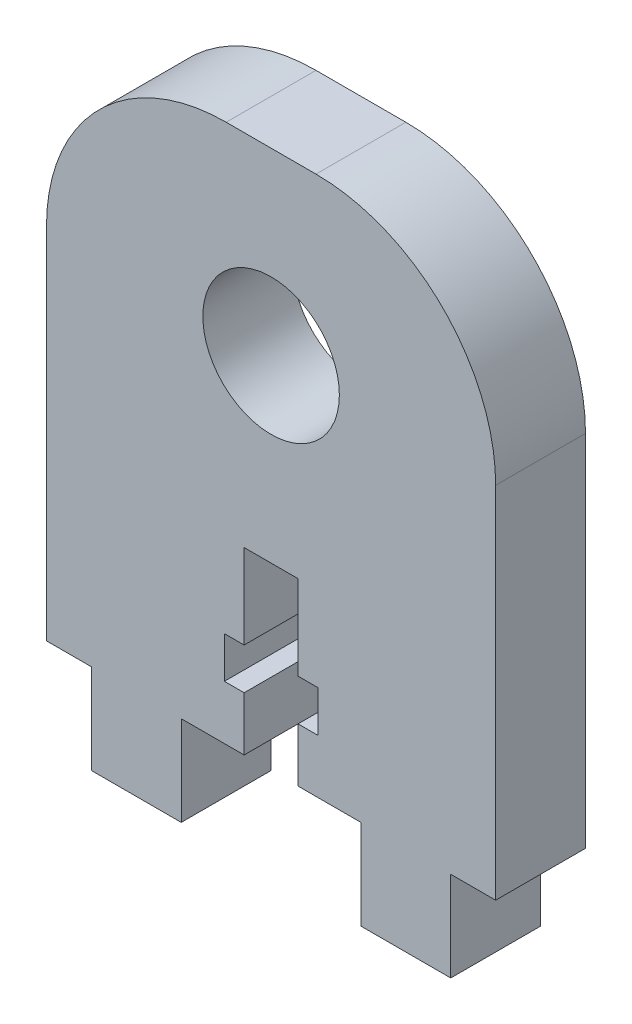
ISO-10303-21;
HEADER;
FILE_DESCRIPTION(('STEP AP214'),'2;1');
FILE_NAME('part.step','',(''),(''),'','','');
FILE_SCHEMA(('AUTOMOTIVE_DESIGN { 1 0 10303 214 1 1 1 1 }'));
ENDSEC;
DATA;
#1=APPLICATION_CONTEXT('core data for automotive mechanical design processes');
#2=APPLICATION_PROTOCOL_DEFINITION('international standard','automotive_design',2000,#1);
#3=PRODUCT_CONTEXT('',#1,'mechanical');
#4=PRODUCT('Part','Part','',(#3));
#5=PRODUCT_RELATED_PRODUCT_CATEGORY('part','',(#4));
#6=PRODUCT_DEFINITION_FORMATION('','',#4);
#7=PRODUCT_DEFINITION_CONTEXT('part definition',#1,'design');
#8=PRODUCT_DEFINITION('design','',#6,#7);
#9=PRODUCT_DEFINITION_SHAPE('','',#8);
#10=(LENGTH_UNIT() NAMED_UNIT(*) SI_UNIT(.MILLI.,.METRE.));
#11=(NAMED_UNIT(*) PLANE_ANGLE_UNIT() SI_UNIT($,.RADIAN.));
#12=(NAMED_UNIT(*) SI_UNIT($,.STERADIAN.) SOLID_ANGLE_UNIT());
#13=UNCERTAINTY_MEASURE_WITH_UNIT(LENGTH_MEASURE(1.E-05),#10,'distance_accuracy_value','');
#14=(GEOMETRIC_REPRESENTATION_CONTEXT(3) GLOBAL_UNCERTAINTY_ASSIGNED_CONTEXT((#13)) GLOBAL_UNIT_ASSIGNED_CONTEXT((#10,
#11,#12)) REPRESENTATION_CONTEXT('',''));
#15=CARTESIAN_POINT('',(0.,0.,0.));
#16=DIRECTION('',(0.,0.,1.));
#17=DIRECTION('',(1.,0.,0.));
#18=AXIS2_PLACEMENT_3D('',#15,#16,#17);
#19=CARTESIAN_POINT('',(-1.5,0.,5.));
#20=DIRECTION('',(1.,0.,0.));
#21=DIRECTION('',(0.,1.,0.));
#22=AXIS2_PLACEMENT_3D('',#19,#20,#21);
#23=PLANE('',#22);
#24=DIRECTION('',(0.,-1.,0.));
#25=VECTOR('',#24,1.);
#26=CARTESIAN_POINT('',(-1.5,0.,0.));
#27=LINE('',#26,#25);
#28=CARTESIAN_POINT('',(-1.5,-12.,0.));
#29=VERTEX_POINT('',#28);
#30=CARTESIAN_POINT('',(-1.5,-15.,0.));
#31=VERTEX_POINT('',#30);
#32=EDGE_CURVE('E219',#29,#31,#27,.T.);
#33=ORIENTED_EDGE('',*,*,#32,.F.);
#34=DIRECTION('',(0.,0.,-1.));
#35=VECTOR('',#34,1.);
#36=CARTESIAN_POINT('',(-1.5,-12.,5.));
#37=LINE('',#36,#35);
#38=CARTESIAN_POINT('',(-1.5,-12.,5.));
#39=VERTEX_POINT('',#38);
#40=EDGE_CURVE('E214',#39,#29,#37,.T.);
#41=ORIENTED_EDGE('',*,*,#40,.F.);
#42=DIRECTION('',(0.,-1.,0.));
#43=VECTOR('',#42,1.);
#44=CARTESIAN_POINT('',(-1.5,0.,5.));
#45=LINE('',#44,#43);
#46=CARTESIAN_POINT('',(-1.5,-15.,5.));
#47=VERTEX_POINT('',#46);
#48=EDGE_CURVE('E217',#39,#47,#45,.T.);
#49=ORIENTED_EDGE('',*,*,#48,.T.);
#50=DIRECTION('',(0.,0.,-1.));
#51=VECTOR('',#50,1.);
#52=CARTESIAN_POINT('',(-1.5,-15.,5.));
#53=LINE('',#52,#51);
#54=EDGE_CURVE('E399',#47,#31,#53,.T.);
#55=ORIENTED_EDGE('',*,*,#54,.T.);
#56=EDGE_LOOP('',(#33,#41,#49,#55));
#57=FACE_BOUND('',#56,.T.);
#58=ADVANCED_FACE('F40',(#57),#23,.T.);
#59=CARTESIAN_POINT('',(0.,-12.,5.));
#60=DIRECTION('',(0.,-1.,0.));
#61=DIRECTION('',(1.,0.,0.));
#62=AXIS2_PLACEMENT_3D('',#59,#60,#61);
#63=PLANE('',#62);
#64=DIRECTION('',(-1.,0.,0.));
#65=VECTOR('',#64,1.);
#66=CARTESIAN_POINT('',(0.,-12.,0.));
#67=LINE('',#66,#65);
#68=CARTESIAN_POINT('',(-2.6,-12.,0.));
#69=VERTEX_POINT('',#68);
#70=EDGE_CURVE('E452',#29,#69,#67,.T.);
#71=ORIENTED_EDGE('',*,*,#70,.T.);
#72=DIRECTION('',(0.,0.,-1.));
#73=VECTOR('',#72,1.);
#74=CARTESIAN_POINT('',(-2.6,-12.,5.));
#75=LINE('',#74,#73);
#76=CARTESIAN_POINT('',(-2.6,-12.,5.));
#77=VERTEX_POINT('',#76);
#78=EDGE_CURVE('E223',#77,#69,#75,.T.);
#79=ORIENTED_EDGE('',*,*,#78,.F.);
#80=DIRECTION('',(-1.,0.,0.));
#81=VECTOR('',#80,1.);
#82=CARTESIAN_POINT('',(0.,-12.,5.));
#83=LINE('',#82,#81);
#84=EDGE_CURVE('E226',#39,#77,#83,.T.);
#85=ORIENTED_EDGE('',*,*,#84,.F.);
#86=ORIENTED_EDGE('',*,*,#40,.T.);
#87=EDGE_LOOP('',(#71,#79,#85,#86));
#88=FACE_BOUND('',#87,.T.);
#89=ADVANCED_FACE('F227',(#88),#63,.F.);
#90=CARTESIAN_POINT('',(-2.60000000000001,0.,5.));
#91=DIRECTION('',(-1.,0.,0.));
#92=DIRECTION('',(0.,-1.,0.));
#93=AXIS2_PLACEMENT_3D('',#90,#91,#92);
#94=PLANE('',#93);
#95=DIRECTION('',(0.,1.,0.));
#96=VECTOR('',#95,1.);
#97=CARTESIAN_POINT('',(-2.60000000000001,0.,0.));
#98=LINE('',#97,#96);
#99=CARTESIAN_POINT('',(-2.6,-9.7,0.));
#100=VERTEX_POINT('',#99);
#101=EDGE_CURVE('E450',#69,#100,#98,.T.);
#102=ORIENTED_EDGE('',*,*,#101,.T.);
#103=DIRECTION('',(0.,0.,-1.));
#104=VECTOR('',#103,1.);
#105=CARTESIAN_POINT('',(-2.6,-9.7,5.));
#106=LINE('',#105,#104);
#107=CARTESIAN_POINT('',(-2.6,-9.7,5.));
#108=VERTEX_POINT('',#107);
#109=EDGE_CURVE('E352',#108,#100,#106,.T.);
#110=ORIENTED_EDGE('',*,*,#109,.F.);
#111=DIRECTION('',(0.,1.,0.));
#112=VECTOR('',#111,1.);
#113=CARTESIAN_POINT('',(-2.60000000000001,0.,5.));
#114=LINE('',#113,#112);
#115=EDGE_CURVE('E231',#77,#108,#114,.T.);
#116=ORIENTED_EDGE('',*,*,#115,.F.);
#117=ORIENTED_EDGE('',*,*,#78,.T.);
#118=EDGE_LOOP('',(#102,#110,#116,#117));
#119=FACE_BOUND('',#118,.T.);
#120=ADVANCED_FACE('F549',(#119),#94,.F.);
#121=CARTESIAN_POINT('',(0.,-9.70000000000001,5.));
#122=DIRECTION('',(0.,1.,0.));
#123=DIRECTION('',(-1.,0.,0.));
#124=AXIS2_PLACEMENT_3D('',#121,#122,#123);
#125=PLANE('',#124);
#126=DIRECTION('',(1.,0.,0.));
#127=VECTOR('',#126,1.);
#128=CARTESIAN_POINT('',(0.,-9.70000000000001,0.));
#129=LINE('',#128,#127);
#130=CARTESIAN_POINT('',(-1.5,-9.70000000000001,0.));
#131=VERTEX_POINT('',#130);
#132=EDGE_CURVE('E447',#100,#131,#129,.T.);
#133=ORIENTED_EDGE('',*,*,#132,.T.);
#134=DIRECTION('',(0.,0.,-1.));
#135=VECTOR('',#134,1.);
#136=CARTESIAN_POINT('',(-1.5,-9.70000000000001,5.));
#137=LINE('',#136,#135);
#138=CARTESIAN_POINT('',(-1.5,-9.70000000000001,5.));
#139=VERTEX_POINT('',#138);
#140=EDGE_CURVE('E355',#139,#131,#137,.T.);
#141=ORIENTED_EDGE('',*,*,#140,.F.);
#142=DIRECTION('',(1.,0.,0.));
#143=VECTOR('',#142,1.);
#144=CARTESIAN_POINT('',(0.,-9.70000000000001,5.));
#145=LINE('',#144,#143);
#146=EDGE_CURVE('E259',#108,#139,#145,.T.);
#147=ORIENTED_EDGE('',*,*,#146,.F.);
#148=ORIENTED_EDGE('',*,*,#109,.T.);
#149=EDGE_LOOP('',(#133,#141,#147,#148));
#150=FACE_BOUND('',#149,.T.);
#151=ADVANCED_FACE('F557',(#150),#125,.F.);
#152=CARTESIAN_POINT('',(-1.5,0.,5.));
#153=DIRECTION('',(1.,0.,0.));
#154=DIRECTION('',(0.,1.,0.));
#155=AXIS2_PLACEMENT_3D('',#152,#153,#154);
#156=PLANE('',#155);
#157=DIRECTION('',(0.,-1.,0.));
#158=VECTOR('',#157,1.);
#159=CARTESIAN_POINT('',(-1.5,0.,0.));
#160=LINE('',#159,#158);
#161=CARTESIAN_POINT('',(-1.5,-5.,0.));
#162=VERTEX_POINT('',#161);
#163=EDGE_CURVE('E444',#162,#131,#160,.T.);
#164=ORIENTED_EDGE('',*,*,#163,.F.);
#165=DIRECTION('',(0.,0.,-1.));
#166=VECTOR('',#165,1.);
#167=CARTESIAN_POINT('',(-1.5,-5.,5.));
#168=LINE('',#167,#166);
#169=CARTESIAN_POINT('',(-1.5,-5.,5.));
#170=VERTEX_POINT('',#169);
#171=EDGE_CURVE('E357',#170,#162,#168,.T.);
#172=ORIENTED_EDGE('',*,*,#171,.F.);
#173=DIRECTION('',(0.,-1.,0.));
#174=VECTOR('',#173,1.);
#175=CARTESIAN_POINT('',(-1.5,0.,5.));
#176=LINE('',#175,#174);
#177=EDGE_CURVE('E263',#170,#139,#176,.T.);
#178=ORIENTED_EDGE('',*,*,#177,.T.);
#179=ORIENTED_EDGE('',*,*,#140,.T.);
#180=EDGE_LOOP('',(#164,#172,#178,#179));
#181=FACE_BOUND('',#180,.T.);
#182=ADVANCED_FACE('F560',(#181),#156,.T.);
#183=CARTESIAN_POINT('',(0.,-5.,5.));
#184=DIRECTION('',(0.,-1.,0.));
#185=DIRECTION('',(0.,0.,-1.));
#186=AXIS2_PLACEMENT_3D('',#183,#184,#185);
#187=PLANE('',#186);
#188=DIRECTION('',(-1.,0.,0.));
#189=VECTOR('',#188,1.);
#190=CARTESIAN_POINT('',(0.,-5.,0.));
#191=LINE('',#190,#189);
#192=CARTESIAN_POINT('',(1.5,-5.,0.));
#193=VERTEX_POINT('',#192);
#194=EDGE_CURVE('E441',#193,#162,#191,.T.);
#195=ORIENTED_EDGE('',*,*,#194,.F.);
#196=DIRECTION('',(0.,0.,-1.));
#197=VECTOR('',#196,1.);
#198=CARTESIAN_POINT('',(1.5,-5.,5.));
#199=LINE('',#198,#197);
#200=CARTESIAN_POINT('',(1.5,-5.,5.));
#201=VERTEX_POINT('',#200);
#202=EDGE_CURVE('E359',#201,#193,#199,.T.);
#203=ORIENTED_EDGE('',*,*,#202,.F.);
#204=DIRECTION('',(-1.,0.,0.));
#205=VECTOR('',#204,1.);
#206=CARTESIAN_POINT('',(0.,-5.,5.));
#207=LINE('',#206,#205);
#208=EDGE_CURVE('E268',#201,#170,#207,.T.);
#209=ORIENTED_EDGE('',*,*,#208,.T.);
#210=ORIENTED_EDGE('',*,*,#171,.T.);
#211=EDGE_LOOP('',(#195,#203,#209,#210));
#212=FACE_BOUND('',#211,.T.);
#213=ADVANCED_FACE('F563',(#212),#187,.T.);
#214=CARTESIAN_POINT('',(1.5,0.,5.));
#215=DIRECTION('',(-1.,0.,0.));
#216=DIRECTION('',(0.,-1.,0.));
#217=AXIS2_PLACEMENT_3D('',#214,#215,#216);
#218=PLANE('',#217);
#219=DIRECTION('',(0.,1.,0.));
#220=VECTOR('',#219,1.);
#221=CARTESIAN_POINT('',(1.5,0.,0.));
#222=LINE('',#221,#220);
#223=CARTESIAN_POINT('',(1.5,-9.70000000000001,0.));
#224=VERTEX_POINT('',#223);
#225=EDGE_CURVE('E438',#224,#193,#222,.T.);
#226=ORIENTED_EDGE('',*,*,#225,.F.);
#227=DIRECTION('',(0.,0.,-1.));
#228=VECTOR('',#227,1.);
#229=CARTESIAN_POINT('',(1.5,-9.70000000000001,5.));
#230=LINE('',#229,#228);
#231=CARTESIAN_POINT('',(1.5,-9.70000000000001,5.));
#232=VERTEX_POINT('',#231);
#233=EDGE_CURVE('E361',#232,#224,#230,.T.);
#234=ORIENTED_EDGE('',*,*,#233,.F.);
#235=DIRECTION('',(0.,1.,0.));
#236=VECTOR('',#235,1.);
#237=CARTESIAN_POINT('',(1.5,0.,5.));
#238=LINE('',#237,#236);
#239=EDGE_CURVE('E276',#232,#201,#238,.T.);
#240=ORIENTED_EDGE('',*,*,#239,.T.);
#241=ORIENTED_EDGE('',*,*,#202,.T.);
#242=EDGE_LOOP('',(#226,#234,#240,#241));
#243=FACE_BOUND('',#242,.T.);
#244=ADVANCED_FACE('F590',(#243),#218,.T.);
#245=CARTESIAN_POINT('',(0.,-9.70000000000001,5.));
#246=DIRECTION('',(0.,1.,0.));
#247=DIRECTION('',(-1.,0.,0.));
#248=AXIS2_PLACEMENT_3D('',#245,#246,#247);
#249=PLANE('',#248);
#250=DIRECTION('',(1.,0.,0.));
#251=VECTOR('',#250,1.);
#252=CARTESIAN_POINT('',(0.,-9.70000000000001,0.));
#253=LINE('',#252,#251);
#254=CARTESIAN_POINT('',(2.6,-9.7,0.));
#255=VERTEX_POINT('',#254);
#256=EDGE_CURVE('E436',#224,#255,#253,.T.);
#257=ORIENTED_EDGE('',*,*,#256,.T.);
#258=DIRECTION('',(0.,0.,-1.));
#259=VECTOR('',#258,1.);
#260=CARTESIAN_POINT('',(2.6,-9.7,5.));
#261=LINE('',#260,#259);
#262=CARTESIAN_POINT('',(2.6,-9.7,5.));
#263=VERTEX_POINT('',#262);
#264=EDGE_CURVE('E363',#263,#255,#261,.T.);
#265=ORIENTED_EDGE('',*,*,#264,.F.);
#266=DIRECTION('',(1.,0.,0.));
#267=VECTOR('',#266,1.);
#268=CARTESIAN_POINT('',(0.,-9.70000000000001,5.));
#269=LINE('',#268,#267);
#270=EDGE_CURVE('E280',#232,#263,#269,.T.);
#271=ORIENTED_EDGE('',*,*,#270,.F.);
#272=ORIENTED_EDGE('',*,*,#233,.T.);
#273=EDGE_LOOP('',(#257,#265,#271,#272));
#274=FACE_BOUND('',#273,.T.);
#275=ADVANCED_FACE('F588',(#274),#249,.F.);
#276=CARTESIAN_POINT('',(2.60000000000001,0.,5.));
#277=DIRECTION('',(1.,0.,0.));
#278=DIRECTION('',(0.,1.,0.));
#279=AXIS2_PLACEMENT_3D('',#276,#277,#278);
#280=PLANE('',#279);
#281=DIRECTION('',(0.,-1.,0.));
#282=VECTOR('',#281,1.);
#283=CARTESIAN_POINT('',(2.60000000000001,0.,0.));
#284=LINE('',#283,#282);
#285=CARTESIAN_POINT('',(2.6,-12.,0.));
#286=VERTEX_POINT('',#285);
#287=EDGE_CURVE('E434',#255,#286,#284,.T.);
#288=ORIENTED_EDGE('',*,*,#287,.T.);
#289=DIRECTION('',(0.,0.,-1.));
#290=VECTOR('',#289,1.);
#291=CARTESIAN_POINT('',(2.6,-12.,5.));
#292=LINE('',#291,#290);
#293=CARTESIAN_POINT('',(2.6,-12.,5.));
#294=VERTEX_POINT('',#293);
#295=EDGE_CURVE('E366',#294,#286,#292,.T.);
#296=ORIENTED_EDGE('',*,*,#295,.F.);
#297=DIRECTION('',(0.,-1.,0.));
#298=VECTOR('',#297,1.);
#299=CARTESIAN_POINT('',(2.60000000000001,0.,5.));
#300=LINE('',#299,#298);
#301=EDGE_CURVE('E284',#263,#294,#300,.T.);
#302=ORIENTED_EDGE('',*,*,#301,.F.);
#303=ORIENTED_EDGE('',*,*,#264,.T.);
#304=EDGE_LOOP('',(#288,#296,#302,#303));
#305=FACE_BOUND('',#304,.T.);
#306=ADVANCED_FACE('F584',(#305),#280,.F.);
#307=CARTESIAN_POINT('',(0.,-12.,5.));
#308=DIRECTION('',(0.,-1.,0.));
#309=DIRECTION('',(0.,0.,-1.));
#310=AXIS2_PLACEMENT_3D('',#307,#308,#309);
#311=PLANE('',#310);
#312=DIRECTION('',(-1.,0.,0.));
#313=VECTOR('',#312,1.);
#314=CARTESIAN_POINT('',(0.,-12.,0.));
#315=LINE('',#314,#313);
#316=CARTESIAN_POINT('',(1.5,-12.,0.));
#317=VERTEX_POINT('',#316);
#318=EDGE_CURVE('E431',#286,#317,#315,.T.);
#319=ORIENTED_EDGE('',*,*,#318,.T.);
#320=DIRECTION('',(0.,0.,-1.));
#321=VECTOR('',#320,1.);
#322=CARTESIAN_POINT('',(1.5,-12.,5.));
#323=LINE('',#322,#321);
#324=CARTESIAN_POINT('',(1.5,-12.,5.));
#325=VERTEX_POINT('',#324);
#326=EDGE_CURVE('E369',#325,#317,#323,.T.);
#327=ORIENTED_EDGE('',*,*,#326,.F.);
#328=DIRECTION('',(-1.,0.,0.));
#329=VECTOR('',#328,1.);
#330=CARTESIAN_POINT('',(0.,-12.,5.));
#331=LINE('',#330,#329);
#332=EDGE_CURVE('E288',#294,#325,#331,.T.);
#333=ORIENTED_EDGE('',*,*,#332,.F.);
#334=ORIENTED_EDGE('',*,*,#295,.T.);
#335=EDGE_LOOP('',(#319,#327,#333,#334));
#336=FACE_BOUND('',#335,.T.);
#337=ADVANCED_FACE('F572',(#336),#311,.F.);
#338=CARTESIAN_POINT('',(1.5,0.,5.));
#339=DIRECTION('',(-1.,0.,0.));
#340=DIRECTION('',(0.,0.,1.));
#341=AXIS2_PLACEMENT_3D('',#338,#339,#340);
#342=PLANE('',#341);
#343=DIRECTION('',(0.,1.,0.));
#344=VECTOR('',#343,1.);
#345=CARTESIAN_POINT('',(1.5,0.,0.));
#346=LINE('',#345,#344);
#347=CARTESIAN_POINT('',(1.5,-15.,0.));
#348=VERTEX_POINT('',#347);
#349=EDGE_CURVE('E428',#348,#317,#346,.T.);
#350=ORIENTED_EDGE('',*,*,#349,.F.);
#351=DIRECTION('',(0.,0.,-1.));
#352=VECTOR('',#351,1.);
#353=CARTESIAN_POINT('',(1.5,-15.,5.));
#354=LINE('',#353,#352);
#355=CARTESIAN_POINT('',(1.5,-15.,5.));
#356=VERTEX_POINT('',#355);
#357=EDGE_CURVE('E371',#356,#348,#354,.T.);
#358=ORIENTED_EDGE('',*,*,#357,.F.);
#359=DIRECTION('',(0.,1.,0.));
#360=VECTOR('',#359,1.);
#361=CARTESIAN_POINT('',(1.5,0.,5.));
#362=LINE('',#361,#360);
#363=EDGE_CURVE('E295',#356,#325,#362,.T.);
#364=ORIENTED_EDGE('',*,*,#363,.T.);
#365=ORIENTED_EDGE('',*,*,#326,.T.);
#366=EDGE_LOOP('',(#350,#358,#364,#365));
#367=FACE_BOUND('',#366,.T.);
#368=ADVANCED_FACE('F576',(#367),#342,.T.);
#369=CARTESIAN_POINT('',(0.,-15.,5.));
#370=DIRECTION('',(0.,1.,0.));
#371=DIRECTION('',(0.,0.,1.));
#372=AXIS2_PLACEMENT_3D('',#369,#370,#371);
#373=PLANE('',#372);
#374=DIRECTION('',(1.,0.,0.));
#375=VECTOR('',#374,1.);
#376=CARTESIAN_POINT('',(0.,-15.,0.));
#377=LINE('',#376,#375);
#378=CARTESIAN_POINT('',(5.,-15.,0.));
#379=VERTEX_POINT('',#378);
#380=EDGE_CURVE('E426',#348,#379,#377,.T.);
#381=ORIENTED_EDGE('',*,*,#380,.T.);
#382=DIRECTION('',(0.,0.,-1.));
#383=VECTOR('',#382,1.);
#384=CARTESIAN_POINT('',(5.,-15.,5.));
#385=LINE('',#384,#383);
#386=CARTESIAN_POINT('',(5.,-15.,5.));
#387=VERTEX_POINT('',#386);
#388=EDGE_CURVE('E373',#387,#379,#385,.T.);
#389=ORIENTED_EDGE('',*,*,#388,.F.);
#390=DIRECTION('',(1.,0.,0.));
#391=VECTOR('',#390,1.);
#392=CARTESIAN_POINT('',(0.,-15.,5.));
#393=LINE('',#392,#391);
#394=EDGE_CURVE('E299',#356,#387,#393,.T.);
#395=ORIENTED_EDGE('',*,*,#394,.F.);
#396=ORIENTED_EDGE('',*,*,#357,.T.);
#397=EDGE_LOOP('',(#381,#389,#395,#396));
#398=FACE_BOUND('',#397,.T.);
#399=ADVANCED_FACE('F579',(#398),#373,.F.);
#400=CARTESIAN_POINT('',(5.,0.,5.));
#401=DIRECTION('',(1.,0.,0.));
#402=DIRECTION('',(0.,1.,0.));
#403=AXIS2_PLACEMENT_3D('',#400,#401,#402);
#404=PLANE('',#403);
#405=DIRECTION('',(0.,-1.,0.));
#406=VECTOR('',#405,1.);
#407=CARTESIAN_POINT('',(5.,0.,0.));
#408=LINE('',#407,#406);
#409=CARTESIAN_POINT('',(5.,-20.,0.));
#410=VERTEX_POINT('',#409);
#411=EDGE_CURVE('E424',#379,#410,#408,.T.);
#412=ORIENTED_EDGE('',*,*,#411,.T.);
#413=DIRECTION('',(0.,0.,-1.));
#414=VECTOR('',#413,1.);
#415=CARTESIAN_POINT('',(5.,-20.,5.));
#416=LINE('',#415,#414);
#417=CARTESIAN_POINT('',(5.,-20.,5.));
#418=VERTEX_POINT('',#417);
#419=EDGE_CURVE('E376',#418,#410,#416,.T.);
#420=ORIENTED_EDGE('',*,*,#419,.F.);
#421=DIRECTION('',(0.,-1.,0.));
#422=VECTOR('',#421,1.);
#423=CARTESIAN_POINT('',(5.,0.,5.));
#424=LINE('',#423,#422);
#425=EDGE_CURVE('E303',#387,#418,#424,.T.);
#426=ORIENTED_EDGE('',*,*,#425,.F.);
#427=ORIENTED_EDGE('',*,*,#388,.T.);
#428=EDGE_LOOP('',(#412,#420,#426,#427));
#429=FACE_BOUND('',#428,.T.);
#430=ADVANCED_FACE('F498',(#429),#404,.F.);
#431=CARTESIAN_POINT('',(0.,-20.,5.));
#432=DIRECTION('',(0.,1.,0.));
#433=DIRECTION('',(0.,0.,1.));
#434=AXIS2_PLACEMENT_3D('',#431,#432,#433);
#435=PLANE('',#434);
#436=DIRECTION('',(1.,0.,0.));
#437=VECTOR('',#436,1.);
#438=CARTESIAN_POINT('',(0.,-20.,0.));
#439=LINE('',#438,#437);
#440=CARTESIAN_POINT('',(10.,-20.,0.));
#441=VERTEX_POINT('',#440);
#442=EDGE_CURVE('E422',#410,#441,#439,.T.);
#443=ORIENTED_EDGE('',*,*,#442,.T.);
#444=DIRECTION('',(0.,0.,-1.));
#445=VECTOR('',#444,1.);
#446=CARTESIAN_POINT('',(10.,-20.,5.));
#447=LINE('',#446,#445);
#448=CARTESIAN_POINT('',(10.,-20.,5.));
#449=VERTEX_POINT('',#448);
#450=EDGE_CURVE('E379',#449,#441,#447,.T.);
#451=ORIENTED_EDGE('',*,*,#450,.F.);
#452=DIRECTION('',(1.,0.,0.));
#453=VECTOR('',#452,1.);
#454=CARTESIAN_POINT('',(0.,-20.,5.));
#455=LINE('',#454,#453);
#456=EDGE_CURVE('E484',#418,#449,#455,.T.);
#457=ORIENTED_EDGE('',*,*,#456,.F.);
#458=ORIENTED_EDGE('',*,*,#419,.T.);
#459=EDGE_LOOP('',(#443,#451,#457,#458));
#460=FACE_BOUND('',#459,.T.);
#461=ADVANCED_FACE('F502',(#460),#435,.F.);
#462=CARTESIAN_POINT('',(10.,0.,5.));
#463=DIRECTION('',(-1.,0.,0.));
#464=DIRECTION('',(0.,0.,1.));
#465=AXIS2_PLACEMENT_3D('',#462,#463,#464);
#466=PLANE('',#465);
#467=DIRECTION('',(0.,1.,0.));
#468=VECTOR('',#467,1.);
#469=CARTESIAN_POINT('',(10.,0.,0.));
#470=LINE('',#469,#468);
#471=CARTESIAN_POINT('',(10.,-15.,0.));
#472=VERTEX_POINT('',#471);
#473=EDGE_CURVE('E420',#441,#472,#470,.T.);
#474=ORIENTED_EDGE('',*,*,#473,.T.);
#475=DIRECTION('',(0.,0.,-1.));
#476=VECTOR('',#475,1.);
#477=CARTESIAN_POINT('',(10.,-15.,5.));
#478=LINE('',#477,#476);
#479=CARTESIAN_POINT('',(10.,-15.,5.));
#480=VERTEX_POINT('',#479);
#481=EDGE_CURVE('E382',#480,#472,#478,.T.);
#482=ORIENTED_EDGE('',*,*,#481,.F.);
#483=DIRECTION('',(0.,1.,0.));
#484=VECTOR('',#483,1.);
#485=CARTESIAN_POINT('',(10.,0.,5.));
#486=LINE('',#485,#484);
#487=EDGE_CURVE('E325',#449,#480,#486,.T.);
#488=ORIENTED_EDGE('',*,*,#487,.F.);
#489=ORIENTED_EDGE('',*,*,#450,.T.);
#490=EDGE_LOOP('',(#474,#482,#488,#489));
#491=FACE_BOUND('',#490,.T.);
#492=ADVANCED_FACE('F505',(#491),#466,.F.);
#493=CARTESIAN_POINT('',(12.5,-15.,0.));
#494=VERTEX_POINT('',#493);
#495=EDGE_CURVE('E419',#472,#494,#377,.T.);
#496=ORIENTED_EDGE('',*,*,#495,.T.);
#497=DIRECTION('',(0.,0.,-1.));
#498=VECTOR('',#497,1.);
#499=CARTESIAN_POINT('',(12.5,-15.,5.));
#500=LINE('',#499,#498);
#501=CARTESIAN_POINT('',(12.5,-15.,5.));
#502=VERTEX_POINT('',#501);
#503=EDGE_CURVE('E385',#502,#494,#500,.T.);
#504=ORIENTED_EDGE('',*,*,#503,.F.);
#505=EDGE_CURVE('E304',#480,#502,#393,.T.);
#506=ORIENTED_EDGE('',*,*,#505,.F.);
#507=ORIENTED_EDGE('',*,*,#481,.T.);
#508=EDGE_LOOP('',(#496,#504,#506,#507));
#509=FACE_BOUND('',#508,.T.);
#510=ADVANCED_FACE('F508',(#509),#373,.F.);
#511=CARTESIAN_POINT('',(12.5,0.,5.));
#512=DIRECTION('',(-1.,0.,0.));
#513=DIRECTION('',(0.,0.,1.));
#514=AXIS2_PLACEMENT_3D('',#511,#512,#513);
#515=PLANE('',#514);
#516=DIRECTION('',(0.,1.,0.));
#517=VECTOR('',#516,1.);
#518=CARTESIAN_POINT('',(12.5,0.,0.));
#519=LINE('',#518,#517);
#520=CARTESIAN_POINT('',(12.5,5.,0.));
#521=VERTEX_POINT('',#520);
#522=EDGE_CURVE('E417',#494,#521,#519,.T.);
#523=ORIENTED_EDGE('',*,*,#522,.T.);
#524=DIRECTION('',(0.,0.,-1.));
#525=VECTOR('',#524,1.);
#526=CARTESIAN_POINT('',(12.5,5.,5.));
#527=LINE('',#526,#525);
#528=CARTESIAN_POINT('',(12.5,5.,5.));
#529=VERTEX_POINT('',#528);
#530=EDGE_CURVE('E12',#521,#529,#527,.F.);
#531=ORIENTED_EDGE('',*,*,#530,.T.);
#532=DIRECTION('',(0.,1.,0.));
#533=VECTOR('',#532,1.);
#534=CARTESIAN_POINT('',(12.5,0.,5.));
#535=LINE('',#534,#533);
#536=EDGE_CURVE('E320',#502,#529,#535,.T.);
#537=ORIENTED_EDGE('',*,*,#536,.F.);
#538=ORIENTED_EDGE('',*,*,#503,.T.);
#539=EDGE_LOOP('',(#523,#531,#537,#538));
#540=FACE_BOUND('',#539,.T.);
#541=ADVANCED_FACE('F510',(#540),#515,.F.);
#542=CARTESIAN_POINT('',(0.,15.,5.));
#543=DIRECTION('',(0.,1.,0.));
#544=DIRECTION('',(0.,0.,1.));
#545=AXIS2_PLACEMENT_3D('',#542,#543,#544);
#546=PLANE('',#545);
#547=DIRECTION('',(1.,0.,0.));
#548=VECTOR('',#547,1.);
#549=CARTESIAN_POINT('',(0.,15.,0.));
#550=LINE('',#549,#548);
#551=CARTESIAN_POINT('',(-2.5,15.,0.));
#552=VERTEX_POINT('',#551);
#553=CARTESIAN_POINT('',(2.5,15.,0.));
#554=VERTEX_POINT('',#553);
#555=EDGE_CURVE('E414',#552,#554,#550,.T.);
#556=ORIENTED_EDGE('',*,*,#555,.F.);
#557=DIRECTION('',(0.,0.,-1.));
#558=VECTOR('',#557,1.);
#559=CARTESIAN_POINT('',(-2.5,15.,5.));
#560=LINE('',#559,#558);
#561=CARTESIAN_POINT('',(-2.5,15.,5.));
#562=VERTEX_POINT('',#561);
#563=EDGE_CURVE('E340',#552,#562,#560,.F.);
#564=ORIENTED_EDGE('',*,*,#563,.T.);
#565=DIRECTION('',(1.,0.,0.));
#566=VECTOR('',#565,1.);
#567=CARTESIAN_POINT('',(0.,15.,5.));
#568=LINE('',#567,#566);
#569=CARTESIAN_POINT('',(2.5,15.,5.));
#570=VERTEX_POINT('',#569);
#571=EDGE_CURVE('E324',#562,#570,#568,.T.);
#572=ORIENTED_EDGE('',*,*,#571,.T.);
#573=DIRECTION('',(0.,0.,-1.));
#574=VECTOR('',#573,1.);
#575=CARTESIAN_POINT('',(2.5,15.,0.));
#576=LINE('',#575,#574);
#577=EDGE_CURVE('E342',#570,#554,#576,.T.);
#578=ORIENTED_EDGE('',*,*,#577,.T.);
#579=EDGE_LOOP('',(#556,#564,#572,#578));
#580=FACE_BOUND('',#579,.T.);
#581=ADVANCED_FACE('F515',(#580),#546,.T.);
#582=CARTESIAN_POINT('',(-12.5,0.,5.));
#583=DIRECTION('',(-1.,0.,0.));
#584=DIRECTION('',(0.,0.,1.));
#585=AXIS2_PLACEMENT_3D('',#582,#583,#584);
#586=PLANE('',#585);
#587=DIRECTION('',(0.,1.,0.));
#588=VECTOR('',#587,1.);
#589=CARTESIAN_POINT('',(-12.5,0.,5.));
#590=LINE('',#589,#588);
#591=CARTESIAN_POINT('',(-12.5,-15.,5.));
#592=VERTEX_POINT('',#591);
#593=CARTESIAN_POINT('',(-12.5,5.,5.));
#594=VERTEX_POINT('',#593);
#595=EDGE_CURVE('E330',#592,#594,#590,.T.);
#596=ORIENTED_EDGE('',*,*,#595,.T.);
#597=DIRECTION('',(0.,0.,-1.));
#598=VECTOR('',#597,1.);
#599=CARTESIAN_POINT('',(-12.5,5.,5.));
#600=LINE('',#599,#598);
#601=CARTESIAN_POINT('',(-12.5,5.,0.));
#602=VERTEX_POINT('',#601);
#603=EDGE_CURVE('E222',#594,#602,#600,.T.);
#604=ORIENTED_EDGE('',*,*,#603,.T.);
#605=DIRECTION('',(0.,1.,0.));
#606=VECTOR('',#605,1.);
#607=CARTESIAN_POINT('',(-12.5,0.,0.));
#608=LINE('',#607,#606);
#609=CARTESIAN_POINT('',(-12.5,-15.,0.));
#610=VERTEX_POINT('',#609);
#611=EDGE_CURVE('E411',#610,#602,#608,.T.);
#612=ORIENTED_EDGE('',*,*,#611,.F.);
#613=DIRECTION('',(0.,0.,-1.));
#614=VECTOR('',#613,1.);
#615=CARTESIAN_POINT('',(-12.5,-15.,5.));
#616=LINE('',#615,#614);
#617=EDGE_CURVE('E388',#592,#610,#616,.T.);
#618=ORIENTED_EDGE('',*,*,#617,.F.);
#619=EDGE_LOOP('',(#596,#604,#612,#618));
#620=FACE_BOUND('',#619,.T.);
#621=ADVANCED_FACE('F527',(#620),#586,.T.);
#622=CARTESIAN_POINT('',(-10.,-15.,0.));
#623=VERTEX_POINT('',#622);
#624=EDGE_CURVE('E410',#610,#623,#377,.T.);
#625=ORIENTED_EDGE('',*,*,#624,.T.);
#626=DIRECTION('',(0.,0.,-1.));
#627=VECTOR('',#626,1.);
#628=CARTESIAN_POINT('',(-10.,-15.,5.));
#629=LINE('',#628,#627);
#630=CARTESIAN_POINT('',(-10.,-15.,5.));
#631=VERTEX_POINT('',#630);
#632=EDGE_CURVE('E390',#631,#623,#629,.T.);
#633=ORIENTED_EDGE('',*,*,#632,.F.);
#634=EDGE_CURVE('E469',#592,#631,#393,.T.);
#635=ORIENTED_EDGE('',*,*,#634,.F.);
#636=ORIENTED_EDGE('',*,*,#617,.T.);
#637=EDGE_LOOP('',(#625,#633,#635,#636));
#638=FACE_BOUND('',#637,.T.);
#639=ADVANCED_FACE('F530',(#638),#373,.F.);
#640=CARTESIAN_POINT('',(-10.,0.,5.));
#641=DIRECTION('',(-1.,0.,0.));
#642=DIRECTION('',(0.,0.,1.));
#643=AXIS2_PLACEMENT_3D('',#640,#641,#642);
#644=PLANE('',#643);
#645=DIRECTION('',(0.,1.,0.));
#646=VECTOR('',#645,1.);
#647=CARTESIAN_POINT('',(-10.,0.,0.));
#648=LINE('',#647,#646);
#649=CARTESIAN_POINT('',(-10.,-20.,0.));
#650=VERTEX_POINT('',#649);
#651=EDGE_CURVE('E407',#650,#623,#648,.T.);
#652=ORIENTED_EDGE('',*,*,#651,.F.);
#653=DIRECTION('',(0.,0.,-1.));
#654=VECTOR('',#653,1.);
#655=CARTESIAN_POINT('',(-10.,-20.,5.));
#656=LINE('',#655,#654);
#657=CARTESIAN_POINT('',(-10.,-20.,5.));
#658=VERTEX_POINT('',#657);
#659=EDGE_CURVE('E392',#658,#650,#656,.T.);
#660=ORIENTED_EDGE('',*,*,#659,.F.);
#661=DIRECTION('',(0.,1.,0.));
#662=VECTOR('',#661,1.);
#663=CARTESIAN_POINT('',(-10.,0.,5.));
#664=LINE('',#663,#662);
#665=EDGE_CURVE('E465',#658,#631,#664,.T.);
#666=ORIENTED_EDGE('',*,*,#665,.T.);
#667=ORIENTED_EDGE('',*,*,#632,.T.);
#668=EDGE_LOOP('',(#652,#660,#666,#667));
#669=FACE_BOUND('',#668,.T.);
#670=ADVANCED_FACE('F532',(#669),#644,.T.);
#671=CARTESIAN_POINT('',(0.,-20.,5.));
#672=DIRECTION('',(0.,-1.,0.));
#673=DIRECTION('',(0.,0.,-1.));
#674=AXIS2_PLACEMENT_3D('',#671,#672,#673);
#675=PLANE('',#674);
#676=DIRECTION('',(-1.,0.,0.));
#677=VECTOR('',#676,1.);
#678=CARTESIAN_POINT('',(0.,-20.,0.));
#679=LINE('',#678,#677);
#680=CARTESIAN_POINT('',(-5.,-20.,0.));
#681=VERTEX_POINT('',#680);
#682=EDGE_CURVE('E404',#681,#650,#679,.T.);
#683=ORIENTED_EDGE('',*,*,#682,.F.);
#684=DIRECTION('',(0.,0.,-1.));
#685=VECTOR('',#684,1.);
#686=CARTESIAN_POINT('',(-5.,-20.,5.));
#687=LINE('',#686,#685);
#688=CARTESIAN_POINT('',(-5.,-20.,5.));
#689=VERTEX_POINT('',#688);
#690=EDGE_CURVE('E394',#689,#681,#687,.T.);
#691=ORIENTED_EDGE('',*,*,#690,.F.);
#692=DIRECTION('',(-1.,0.,0.));
#693=VECTOR('',#692,1.);
#694=CARTESIAN_POINT('',(0.,-20.,5.));
#695=LINE('',#694,#693);
#696=EDGE_CURVE('E462',#689,#658,#695,.T.);
#697=ORIENTED_EDGE('',*,*,#696,.T.);
#698=ORIENTED_EDGE('',*,*,#659,.T.);
#699=EDGE_LOOP('',(#683,#691,#697,#698));
#700=FACE_BOUND('',#699,.T.);
#701=ADVANCED_FACE('F537',(#700),#675,.T.);
#702=CARTESIAN_POINT('',(-5.,0.,5.));
#703=DIRECTION('',(-1.,0.,0.));
#704=DIRECTION('',(0.,-1.,0.));
#705=AXIS2_PLACEMENT_3D('',#702,#703,#704);
#706=PLANE('',#705);
#707=DIRECTION('',(0.,1.,0.));
#708=VECTOR('',#707,1.);
#709=CARTESIAN_POINT('',(-5.,0.,0.));
#710=LINE('',#709,#708);
#711=CARTESIAN_POINT('',(-5.,-15.,0.));
#712=VERTEX_POINT('',#711);
#713=EDGE_CURVE('E402',#681,#712,#710,.T.);
#714=ORIENTED_EDGE('',*,*,#713,.T.);
#715=DIRECTION('',(0.,0.,-1.));
#716=VECTOR('',#715,1.);
#717=CARTESIAN_POINT('',(-5.,-15.,5.));
#718=LINE('',#717,#716);
#719=CARTESIAN_POINT('',(-5.,-15.,5.));
#720=VERTEX_POINT('',#719);
#721=EDGE_CURVE('E396',#720,#712,#718,.T.);
#722=ORIENTED_EDGE('',*,*,#721,.F.);
#723=DIRECTION('',(0.,1.,0.));
#724=VECTOR('',#723,1.);
#725=CARTESIAN_POINT('',(-5.,0.,5.));
#726=LINE('',#725,#724);
#727=EDGE_CURVE('E458',#689,#720,#726,.T.);
#728=ORIENTED_EDGE('',*,*,#727,.F.);
#729=ORIENTED_EDGE('',*,*,#690,.T.);
#730=EDGE_LOOP('',(#714,#722,#728,#729));
#731=FACE_BOUND('',#730,.T.);
#732=ADVANCED_FACE('F542',(#731),#706,.F.);
#733=EDGE_CURVE('E243',#712,#31,#377,.T.);
#734=ORIENTED_EDGE('',*,*,#733,.T.);
#735=ORIENTED_EDGE('',*,*,#54,.F.);
#736=EDGE_CURVE('E236',#720,#47,#393,.T.);
#737=ORIENTED_EDGE('',*,*,#736,.F.);
#738=ORIENTED_EDGE('',*,*,#721,.T.);
#739=EDGE_LOOP('',(#734,#735,#737,#738));
#740=FACE_BOUND('',#739,.T.);
#741=ADVANCED_FACE('F545',(#740),#373,.F.);
#742=CARTESIAN_POINT('',(0.,5.,5.));
#743=DIRECTION('',(0.,0.,-1.));
#744=DIRECTION('',(-1.,0.,0.));
#745=AXIS2_PLACEMENT_3D('',#742,#743,#744);
#746=CYLINDRICAL_SURFACE('',#745,3.8);
#747=CARTESIAN_POINT('',(0.,5.,5.));
#748=DIRECTION('',(0.,0.,1.));
#749=DIRECTION('',(1.,0.,0.));
#750=AXIS2_PLACEMENT_3D('',#747,#748,#749);
#751=CIRCLE('',#750,3.8);
#752=CARTESIAN_POINT('',(3.8,5.,5.));
#753=VERTEX_POINT('',#752);
#754=EDGE_CURVE('E400',#753,#753,#751,.T.);
#755=ORIENTED_EDGE('',*,*,#754,.T.);
#756=EDGE_LOOP('',(#755));
#757=FACE_BOUND('',#756,.T.);
#758=CARTESIAN_POINT('',(0.,5.,0.));
#759=DIRECTION('',(0.,0.,1.));
#760=DIRECTION('',(1.,0.,0.));
#761=AXIS2_PLACEMENT_3D('',#758,#759,#760);
#762=CIRCLE('',#761,3.8);
#763=CARTESIAN_POINT('',(3.8,5.,0.));
#764=VERTEX_POINT('',#763);
#765=EDGE_CURVE('E239',#764,#764,#762,.T.);
#766=ORIENTED_EDGE('',*,*,#765,.F.);
#767=EDGE_LOOP('',(#766));
#768=FACE_BOUND('',#767,.T.);
#769=ADVANCED_FACE('F615',(#757,#768),#746,.F.);
#770=CARTESIAN_POINT('',(0.,0.,5.));
#771=DIRECTION('',(0.,0.,1.));
#772=DIRECTION('',(1.,0.,0.));
#773=AXIS2_PLACEMENT_3D('',#770,#771,#772);
#774=PLANE('',#773);
#775=ORIENTED_EDGE('',*,*,#571,.F.);
#776=CARTESIAN_POINT('',(-2.5,5.,5.));
#777=DIRECTION('',(0.,0.,1.));
#778=DIRECTION('',(1.,0.,0.));
#779=AXIS2_PLACEMENT_3D('',#776,#777,#778);
#780=CIRCLE('',#779,10.);
#781=EDGE_CURVE('E48',#562,#594,#780,.T.);
#782=ORIENTED_EDGE('',*,*,#781,.T.);
#783=ORIENTED_EDGE('',*,*,#595,.F.);
#784=ORIENTED_EDGE('',*,*,#634,.T.);
#785=ORIENTED_EDGE('',*,*,#665,.F.);
#786=ORIENTED_EDGE('',*,*,#696,.F.);
#787=ORIENTED_EDGE('',*,*,#727,.T.);
#788=ORIENTED_EDGE('',*,*,#736,.T.);
#789=ORIENTED_EDGE('',*,*,#48,.F.);
#790=ORIENTED_EDGE('',*,*,#84,.T.);
#791=ORIENTED_EDGE('',*,*,#115,.T.);
#792=ORIENTED_EDGE('',*,*,#146,.T.);
#793=ORIENTED_EDGE('',*,*,#177,.F.);
#794=ORIENTED_EDGE('',*,*,#208,.F.);
#795=ORIENTED_EDGE('',*,*,#239,.F.);
#796=ORIENTED_EDGE('',*,*,#270,.T.);
#797=ORIENTED_EDGE('',*,*,#301,.T.);
#798=ORIENTED_EDGE('',*,*,#332,.T.);
#799=ORIENTED_EDGE('',*,*,#363,.F.);
#800=ORIENTED_EDGE('',*,*,#394,.T.);
#801=ORIENTED_EDGE('',*,*,#425,.T.);
#802=ORIENTED_EDGE('',*,*,#456,.T.);
#803=ORIENTED_EDGE('',*,*,#487,.T.);
#804=ORIENTED_EDGE('',*,*,#505,.T.);
#805=ORIENTED_EDGE('',*,*,#536,.T.);
#806=CARTESIAN_POINT('',(2.5,5.,5.));
#807=DIRECTION('',(0.,0.,1.));
#808=DIRECTION('',(1.,0.,0.));
#809=AXIS2_PLACEMENT_3D('',#806,#807,#808);
#810=CIRCLE('',#809,10.);
#811=EDGE_CURVE('E60',#529,#570,#810,.T.);
#812=ORIENTED_EDGE('',*,*,#811,.T.);
#813=EDGE_LOOP('',(#775,#782,#783,#784,#785,#786,#787,#788,#789,#790,#791,#792,#793,#794,#795,
#796,#797,#798,#799,#800,#801,#802,#803,#804,#805,#812));
#814=FACE_BOUND('',#813,.T.);
#815=ORIENTED_EDGE('',*,*,#754,.F.);
#816=EDGE_LOOP('',(#815));
#817=FACE_BOUND('',#816,.T.);
#818=ADVANCED_FACE('F233',(#814,#817),#774,.T.);
#819=CARTESIAN_POINT('',(0.,0.,0.));
#820=DIRECTION('',(0.,0.,1.));
#821=DIRECTION('',(1.,0.,0.));
#822=AXIS2_PLACEMENT_3D('',#819,#820,#821);
#823=PLANE('',#822);
#824=ORIENTED_EDGE('',*,*,#611,.T.);
#825=CARTESIAN_POINT('',(-2.5,5.,0.));
#826=DIRECTION('',(0.,0.,1.));
#827=DIRECTION('',(1.,0.,0.));
#828=AXIS2_PLACEMENT_3D('',#825,#826,#827);
#829=CIRCLE('',#828,10.);
#830=EDGE_CURVE('E345',#602,#552,#829,.F.);
#831=ORIENTED_EDGE('',*,*,#830,.T.);
#832=ORIENTED_EDGE('',*,*,#555,.T.);
#833=CARTESIAN_POINT('',(2.5,5.,0.));
#834=DIRECTION('',(0.,0.,1.));
#835=DIRECTION('',(1.,0.,0.));
#836=AXIS2_PLACEMENT_3D('',#833,#834,#835);
#837=CIRCLE('',#836,10.);
#838=EDGE_CURVE('E347',#554,#521,#837,.F.);
#839=ORIENTED_EDGE('',*,*,#838,.T.);
#840=ORIENTED_EDGE('',*,*,#522,.F.);
#841=ORIENTED_EDGE('',*,*,#495,.F.);
#842=ORIENTED_EDGE('',*,*,#473,.F.);
#843=ORIENTED_EDGE('',*,*,#442,.F.);
#844=ORIENTED_EDGE('',*,*,#411,.F.);
#845=ORIENTED_EDGE('',*,*,#380,.F.);
#846=ORIENTED_EDGE('',*,*,#349,.T.);
#847=ORIENTED_EDGE('',*,*,#318,.F.);
#848=ORIENTED_EDGE('',*,*,#287,.F.);
#849=ORIENTED_EDGE('',*,*,#256,.F.);
#850=ORIENTED_EDGE('',*,*,#225,.T.);
#851=ORIENTED_EDGE('',*,*,#194,.T.);
#852=ORIENTED_EDGE('',*,*,#163,.T.);
#853=ORIENTED_EDGE('',*,*,#132,.F.);
#854=ORIENTED_EDGE('',*,*,#101,.F.);
#855=ORIENTED_EDGE('',*,*,#70,.F.);
#856=ORIENTED_EDGE('',*,*,#32,.T.);
#857=ORIENTED_EDGE('',*,*,#733,.F.);
#858=ORIENTED_EDGE('',*,*,#713,.F.);
#859=ORIENTED_EDGE('',*,*,#682,.T.);
#860=ORIENTED_EDGE('',*,*,#651,.T.);
#861=ORIENTED_EDGE('',*,*,#624,.F.);
#862=EDGE_LOOP('',(#824,#831,#832,#839,#840,#841,#842,#843,#844,#845,#846,#847,#848,#849,#850,
#851,#852,#853,#854,#855,#856,#857,#858,#859,#860,#861));
#863=FACE_BOUND('',#862,.T.);
#864=ORIENTED_EDGE('',*,*,#765,.T.);
#865=EDGE_LOOP('',(#864));
#866=FACE_BOUND('',#865,.T.);
#867=ADVANCED_FACE('F518',(#863,#866),#823,.F.);
#868=CARTESIAN_POINT('',(-2.5,5.,5.));
#869=DIRECTION('',(0.,0.,-1.));
#870=DIRECTION('',(-1.,0.,0.));
#871=AXIS2_PLACEMENT_3D('',#868,#869,#870);
#872=CYLINDRICAL_SURFACE('',#871,10.);
#873=ORIENTED_EDGE('',*,*,#781,.F.);
#874=ORIENTED_EDGE('',*,*,#563,.F.);
#875=ORIENTED_EDGE('',*,*,#830,.F.);
#876=ORIENTED_EDGE('',*,*,#603,.F.);
#877=EDGE_LOOP('',(#873,#874,#875,#876));
#878=FACE_BOUND('',#877,.T.);
#879=ADVANCED_FACE('F525',(#878),#872,.T.);
#880=CARTESIAN_POINT('',(2.5,5.,5.));
#881=DIRECTION('',(0.,0.,1.));
#882=DIRECTION('',(1.,0.,0.));
#883=AXIS2_PLACEMENT_3D('',#880,#881,#882);
#884=CYLINDRICAL_SURFACE('',#883,10.);
#885=ORIENTED_EDGE('',*,*,#811,.F.);
#886=ORIENTED_EDGE('',*,*,#530,.F.);
#887=ORIENTED_EDGE('',*,*,#838,.F.);
#888=ORIENTED_EDGE('',*,*,#577,.F.);
#889=EDGE_LOOP('',(#885,#886,#887,#888));
#890=FACE_BOUND('',#889,.T.);
#891=ADVANCED_FACE('F42',(#890),#884,.T.);
#892=CLOSED_SHELL('',(#58,#89,#120,#151,#182,#213,#244,#275,#306,#337,#368,#399,#430,#461,#492,
#510,#541,#581,#621,#639,#670,#701,#732,#741,#769,#818,#867,#879,#891));
#893=MANIFOLD_SOLID_BREP('B2',#892);
#894=ADVANCED_BREP_SHAPE_REPRESENTATION('',(#18,#893),#14);
#895=SHAPE_DEFINITION_REPRESENTATION(#9,#894);
ENDSEC;
END-ISO-10303-21;
